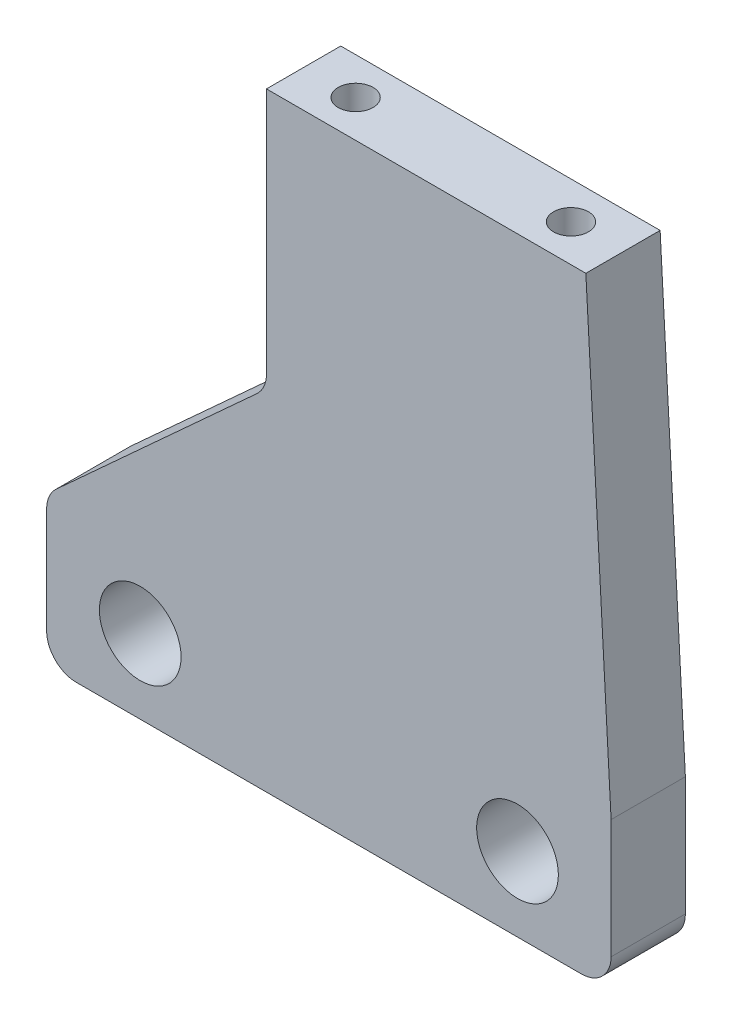
ISO-10303-21;
HEADER;
FILE_DESCRIPTION(('STEP AP214'),'2;1');
FILE_NAME('part.step','',(''),(''),'','','');
FILE_SCHEMA(('AUTOMOTIVE_DESIGN { 1 0 10303 214 1 1 1 1 }'));
ENDSEC;
DATA;
#1=APPLICATION_CONTEXT('core data for automotive mechanical design processes');
#2=APPLICATION_PROTOCOL_DEFINITION('international standard','automotive_design',2000,#1);
#3=PRODUCT_CONTEXT('',#1,'mechanical');
#4=PRODUCT('Part','Part','',(#3));
#5=PRODUCT_RELATED_PRODUCT_CATEGORY('part','',(#4));
#6=PRODUCT_DEFINITION_FORMATION('','',#4);
#7=PRODUCT_DEFINITION_CONTEXT('part definition',#1,'design');
#8=PRODUCT_DEFINITION('design','',#6,#7);
#9=PRODUCT_DEFINITION_SHAPE('','',#8);
#10=(LENGTH_UNIT() NAMED_UNIT(*) SI_UNIT(.MILLI.,.METRE.));
#11=(NAMED_UNIT(*) PLANE_ANGLE_UNIT() SI_UNIT($,.RADIAN.));
#12=(NAMED_UNIT(*) SI_UNIT($,.STERADIAN.) SOLID_ANGLE_UNIT());
#13=UNCERTAINTY_MEASURE_WITH_UNIT(LENGTH_MEASURE(1.E-05),#10,'distance_accuracy_value','');
#14=(GEOMETRIC_REPRESENTATION_CONTEXT(3) GLOBAL_UNCERTAINTY_ASSIGNED_CONTEXT((#13)) GLOBAL_UNIT_ASSIGNED_CONTEXT((#10,
#11,#12)) REPRESENTATION_CONTEXT('',''));
#15=CARTESIAN_POINT('',(0.,0.,0.));
#16=DIRECTION('',(0.,0.,1.));
#17=DIRECTION('',(1.,0.,0.));
#18=AXIS2_PLACEMENT_3D('',#15,#16,#17);
#19=CARTESIAN_POINT('',(19.,5.,5.));
#20=DIRECTION('',(-1.,0.,0.));
#21=DIRECTION('',(0.,0.,1.));
#22=AXIS2_PLACEMENT_3D('',#19,#20,#21);
#23=PLANE('',#22);
#24=DIRECTION('',(0.,1.,0.));
#25=VECTOR('',#24,1.);
#26=CARTESIAN_POINT('',(19.,5.,5.));
#27=LINE('',#26,#25);
#28=CARTESIAN_POINT('',(19.,-3.,5.));
#29=VERTEX_POINT('',#28);
#30=CARTESIAN_POINT('',(19.,5.,5.));
#31=VERTEX_POINT('',#30);
#32=EDGE_CURVE('E153',#29,#31,#27,.T.);
#33=ORIENTED_EDGE('',*,*,#32,.F.);
#34=DIRECTION('',(0.,0.,-1.));
#35=VECTOR('',#34,1.);
#36=CARTESIAN_POINT('',(19.,-3.,5.));
#37=LINE('',#36,#35);
#38=CARTESIAN_POINT('',(19.,-3.,0.));
#39=VERTEX_POINT('',#38);
#40=EDGE_CURVE('E230',#29,#39,#37,.T.);
#41=ORIENTED_EDGE('',*,*,#40,.T.);
#42=DIRECTION('',(0.,1.,0.));
#43=VECTOR('',#42,1.);
#44=CARTESIAN_POINT('',(19.,5.,0.));
#45=LINE('',#44,#43);
#46=CARTESIAN_POINT('',(19.,5.,0.));
#47=VERTEX_POINT('',#46);
#48=EDGE_CURVE('E198',#39,#47,#45,.T.);
#49=ORIENTED_EDGE('',*,*,#48,.T.);
#50=DIRECTION('',(0.,0.,-1.));
#51=VECTOR('',#50,1.);
#52=CARTESIAN_POINT('',(19.,5.,5.));
#53=LINE('',#52,#51);
#54=EDGE_CURVE('E219',#31,#47,#53,.T.);
#55=ORIENTED_EDGE('',*,*,#54,.F.);
#56=EDGE_LOOP('',(#33,#41,#49,#55));
#57=FACE_BOUND('',#56,.T.);
#58=ADVANCED_FACE('F39',(#57),#23,.F.);
#59=CARTESIAN_POINT('',(-19.,5.,5.));
#60=DIRECTION('',(1.,0.,0.));
#61=DIRECTION('',(0.,0.,-1.));
#62=AXIS2_PLACEMENT_3D('',#59,#60,#61);
#63=PLANE('',#62);
#64=DIRECTION('',(0.,-1.,0.));
#65=VECTOR('',#64,1.);
#66=CARTESIAN_POINT('',(-19.,5.,5.));
#67=LINE('',#66,#65);
#68=CARTESIAN_POINT('',(-19.,4.11726702158369,5.));
#69=VERTEX_POINT('',#68);
#70=CARTESIAN_POINT('',(-19.,-3.,5.));
#71=VERTEX_POINT('',#70);
#72=EDGE_CURVE('E212',#69,#71,#67,.T.);
#73=ORIENTED_EDGE('',*,*,#72,.F.);
#74=DIRECTION('',(0.,0.,-1.));
#75=VECTOR('',#74,1.);
#76=CARTESIAN_POINT('',(-19.,4.11726702158369,0.));
#77=LINE('',#76,#75);
#78=CARTESIAN_POINT('',(-19.,4.11726702158369,0.));
#79=VERTEX_POINT('',#78);
#80=EDGE_CURVE('E270',#69,#79,#77,.T.);
#81=ORIENTED_EDGE('',*,*,#80,.T.);
#82=DIRECTION('',(0.,-1.,0.));
#83=VECTOR('',#82,1.);
#84=CARTESIAN_POINT('',(-19.,5.,0.));
#85=LINE('',#84,#83);
#86=CARTESIAN_POINT('',(-19.,-3.,0.));
#87=VERTEX_POINT('',#86);
#88=EDGE_CURVE('E222',#79,#87,#85,.T.);
#89=ORIENTED_EDGE('',*,*,#88,.T.);
#90=DIRECTION('',(0.,0.,-1.));
#91=VECTOR('',#90,1.);
#92=CARTESIAN_POINT('',(-19.,-3.,5.));
#93=LINE('',#92,#91);
#94=EDGE_CURVE('E62',#87,#71,#93,.F.);
#95=ORIENTED_EDGE('',*,*,#94,.T.);
#96=EDGE_LOOP('',(#73,#81,#89,#95));
#97=FACE_BOUND('',#96,.T.);
#98=ADVANCED_FACE('F303',(#97),#63,.F.);
#99=CARTESIAN_POINT('',(-19.,-5.,5.));
#100=DIRECTION('',(0.,1.,0.));
#101=DIRECTION('',(0.,0.,1.));
#102=AXIS2_PLACEMENT_3D('',#99,#100,#101);
#103=PLANE('',#102);
#104=DIRECTION('',(1.,0.,0.));
#105=VECTOR('',#104,1.);
#106=CARTESIAN_POINT('',(-19.,-5.,0.));
#107=LINE('',#106,#105);
#108=CARTESIAN_POINT('',(-17.,-5.,0.));
#109=VERTEX_POINT('',#108);
#110=CARTESIAN_POINT('',(17.,-5.,0.));
#111=VERTEX_POINT('',#110);
#112=EDGE_CURVE('E213',#109,#111,#107,.T.);
#113=ORIENTED_EDGE('',*,*,#112,.T.);
#114=DIRECTION('',(0.,0.,-1.));
#115=VECTOR('',#114,1.);
#116=CARTESIAN_POINT('',(17.,-5.,5.));
#117=LINE('',#116,#115);
#118=CARTESIAN_POINT('',(17.,-5.,5.));
#119=VERTEX_POINT('',#118);
#120=EDGE_CURVE('E247',#111,#119,#117,.F.);
#121=ORIENTED_EDGE('',*,*,#120,.T.);
#122=DIRECTION('',(1.,0.,0.));
#123=VECTOR('',#122,1.);
#124=CARTESIAN_POINT('',(-19.,-5.,5.));
#125=LINE('',#124,#123);
#126=CARTESIAN_POINT('',(-17.,-5.,5.));
#127=VERTEX_POINT('',#126);
#128=EDGE_CURVE('E216',#127,#119,#125,.T.);
#129=ORIENTED_EDGE('',*,*,#128,.F.);
#130=DIRECTION('',(0.,0.,-1.));
#131=VECTOR('',#130,1.);
#132=CARTESIAN_POINT('',(-17.,-5.,5.));
#133=LINE('',#132,#131);
#134=EDGE_CURVE('E243',#127,#109,#133,.T.);
#135=ORIENTED_EDGE('',*,*,#134,.T.);
#136=EDGE_LOOP('',(#113,#121,#129,#135));
#137=FACE_BOUND('',#136,.T.);
#138=ADVANCED_FACE('F309',(#137),#103,.F.);
#139=CARTESIAN_POINT('',(0.,0.,5.));
#140=DIRECTION('',(0.,0.,1.));
#141=DIRECTION('',(1.,0.,0.));
#142=AXIS2_PLACEMENT_3D('',#139,#140,#141);
#143=PLANE('',#142);
#144=ORIENTED_EDGE('',*,*,#128,.T.);
#145=CARTESIAN_POINT('',(17.,-3.,5.));
#146=DIRECTION('',(0.,0.,1.));
#147=DIRECTION('',(1.,0.,0.));
#148=AXIS2_PLACEMENT_3D('',#145,#146,#147);
#149=CIRCLE('',#148,2.);
#150=EDGE_CURVE('E256',#119,#29,#149,.T.);
#151=ORIENTED_EDGE('',*,*,#150,.T.);
#152=ORIENTED_EDGE('',*,*,#32,.T.);
#153=DIRECTION('',(-0.0547564374037948,0.998499740892728,0.));
#154=VECTOR('',#153,1.);
#155=CARTESIAN_POINT('',(19.,5.,5.));
#156=LINE('',#155,#154);
#157=CARTESIAN_POINT('',(17.3,36.,5.));
#158=VERTEX_POINT('',#157);
#159=EDGE_CURVE('E143',#31,#158,#156,.T.);
#160=ORIENTED_EDGE('',*,*,#159,.T.);
#161=DIRECTION('',(-1.,0.,0.));
#162=VECTOR('',#161,1.);
#163=CARTESIAN_POINT('',(17.3,36.,5.));
#164=LINE('',#163,#162);
#165=CARTESIAN_POINT('',(-4.19999999999999,36.,5.));
#166=VERTEX_POINT('',#165);
#167=EDGE_CURVE('E123',#158,#166,#164,.T.);
#168=ORIENTED_EDGE('',*,*,#167,.T.);
#169=DIRECTION('',(0.,-1.,0.));
#170=VECTOR('',#169,1.);
#171=CARTESIAN_POINT('',(-4.19999999999999,5.,5.));
#172=LINE('',#171,#170);
#173=CARTESIAN_POINT('',(-4.19999999999999,19.3827329784163,5.));
#174=VERTEX_POINT('',#173);
#175=EDGE_CURVE('E135',#166,#174,#172,.T.);
#176=ORIENTED_EDGE('',*,*,#175,.T.);
#177=CARTESIAN_POINT('',(-6.19999999999999,19.3827329784163,5.));
#178=DIRECTION('',(0.,0.,1.));
#179=DIRECTION('',(1.,0.,0.));
#180=AXIS2_PLACEMENT_3D('',#177,#178,#179);
#181=CIRCLE('',#180,2.);
#182=CARTESIAN_POINT('',(-4.85217162379431,17.905113721539,5.));
#183=VERTEX_POINT('',#182);
#184=EDGE_CURVE('E48',#174,#183,#181,.F.);
#185=ORIENTED_EDGE('',*,*,#184,.T.);
#186=DIRECTION('',(-0.738809628438671,-0.673914188102842,0.));
#187=VECTOR('',#186,1.);
#188=CARTESIAN_POINT('',(-19.,5.,5.));
#189=LINE('',#188,#187);
#190=CARTESIAN_POINT('',(-18.3478283762057,5.59488627846103,5.));
#191=VERTEX_POINT('',#190);
#192=EDGE_CURVE('E165',#183,#191,#189,.T.);
#193=ORIENTED_EDGE('',*,*,#192,.T.);
#194=CARTESIAN_POINT('',(-17.,4.11726702158369,5.));
#195=DIRECTION('',(0.,0.,1.));
#196=DIRECTION('',(1.,0.,0.));
#197=AXIS2_PLACEMENT_3D('',#194,#195,#196);
#198=CIRCLE('',#197,2.);
#199=EDGE_CURVE('E253',#191,#69,#198,.T.);
#200=ORIENTED_EDGE('',*,*,#199,.T.);
#201=ORIENTED_EDGE('',*,*,#72,.T.);
#202=CARTESIAN_POINT('',(-17.,-3.,5.));
#203=DIRECTION('',(0.,0.,1.));
#204=DIRECTION('',(1.,0.,0.));
#205=AXIS2_PLACEMENT_3D('',#202,#203,#204);
#206=CIRCLE('',#205,2.);
#207=EDGE_CURVE('E250',#71,#127,#206,.T.);
#208=ORIENTED_EDGE('',*,*,#207,.T.);
#209=EDGE_LOOP('',(#144,#151,#152,#160,#168,#176,#185,#193,#200,#201,#208));
#210=FACE_BOUND('',#209,.T.);
#211=CARTESIAN_POINT('',(-12.7,0.,5.));
#212=DIRECTION('',(0.,0.,1.));
#213=DIRECTION('',(1.,0.,0.));
#214=AXIS2_PLACEMENT_3D('',#211,#212,#213);
#215=CIRCLE('',#214,2.75);
#216=CARTESIAN_POINT('',(-9.95,0.,5.));
#217=VERTEX_POINT('',#216);
#218=EDGE_CURVE('E199',#217,#217,#215,.T.);
#219=ORIENTED_EDGE('',*,*,#218,.F.);
#220=EDGE_LOOP('',(#219));
#221=FACE_BOUND('',#220,.T.);
#222=CARTESIAN_POINT('',(12.7,0.,5.));
#223=DIRECTION('',(0.,0.,1.));
#224=DIRECTION('',(1.,0.,0.));
#225=AXIS2_PLACEMENT_3D('',#222,#223,#224);
#226=CIRCLE('',#225,2.75);
#227=CARTESIAN_POINT('',(15.45,0.,5.));
#228=VERTEX_POINT('',#227);
#229=EDGE_CURVE('E192',#228,#228,#226,.T.);
#230=ORIENTED_EDGE('',*,*,#229,.F.);
#231=EDGE_LOOP('',(#230));
#232=FACE_BOUND('',#231,.T.);
#233=ADVANCED_FACE('F150',(#210,#221,#232),#143,.T.);
#234=CARTESIAN_POINT('',(0.,0.,0.));
#235=DIRECTION('',(0.,0.,1.));
#236=DIRECTION('',(1.,0.,0.));
#237=AXIS2_PLACEMENT_3D('',#234,#235,#236);
#238=PLANE('',#237);
#239=ORIENTED_EDGE('',*,*,#48,.F.);
#240=CARTESIAN_POINT('',(17.,-3.,0.));
#241=DIRECTION('',(0.,0.,1.));
#242=DIRECTION('',(1.,0.,0.));
#243=AXIS2_PLACEMENT_3D('',#240,#241,#242);
#244=CIRCLE('',#243,2.);
#245=EDGE_CURVE('E240',#39,#111,#244,.F.);
#246=ORIENTED_EDGE('',*,*,#245,.T.);
#247=ORIENTED_EDGE('',*,*,#112,.F.);
#248=CARTESIAN_POINT('',(-17.,-3.,0.));
#249=DIRECTION('',(0.,0.,1.));
#250=DIRECTION('',(1.,0.,0.));
#251=AXIS2_PLACEMENT_3D('',#248,#249,#250);
#252=CIRCLE('',#251,2.);
#253=EDGE_CURVE('E234',#109,#87,#252,.F.);
#254=ORIENTED_EDGE('',*,*,#253,.T.);
#255=ORIENTED_EDGE('',*,*,#88,.F.);
#256=CARTESIAN_POINT('',(-17.,4.11726702158369,0.));
#257=DIRECTION('',(0.,0.,1.));
#258=DIRECTION('',(1.,0.,0.));
#259=AXIS2_PLACEMENT_3D('',#256,#257,#258);
#260=CIRCLE('',#259,2.);
#261=CARTESIAN_POINT('',(-18.3478283762057,5.59488627846103,0.));
#262=VERTEX_POINT('',#261);
#263=EDGE_CURVE('E237',#79,#262,#260,.F.);
#264=ORIENTED_EDGE('',*,*,#263,.T.);
#265=DIRECTION('',(-0.738809628438671,-0.673914188102842,0.));
#266=VECTOR('',#265,1.);
#267=CARTESIAN_POINT('',(-19.,5.,0.));
#268=LINE('',#267,#266);
#269=CARTESIAN_POINT('',(-4.85217162379431,17.905113721539,0.));
#270=VERTEX_POINT('',#269);
#271=EDGE_CURVE('E136',#270,#262,#268,.T.);
#272=ORIENTED_EDGE('',*,*,#271,.F.);
#273=CARTESIAN_POINT('',(-6.19999999999999,19.3827329784163,0.));
#274=DIRECTION('',(0.,0.,1.));
#275=DIRECTION('',(1.,0.,0.));
#276=AXIS2_PLACEMENT_3D('',#273,#274,#275);
#277=CIRCLE('',#276,2.);
#278=CARTESIAN_POINT('',(-4.19999999999999,19.3827329784163,0.));
#279=VERTEX_POINT('',#278);
#280=EDGE_CURVE('E11',#270,#279,#277,.T.);
#281=ORIENTED_EDGE('',*,*,#280,.T.);
#282=DIRECTION('',(0.,-1.,0.));
#283=VECTOR('',#282,1.);
#284=CARTESIAN_POINT('',(-4.19999999999999,5.,0.));
#285=LINE('',#284,#283);
#286=CARTESIAN_POINT('',(-4.19999999999999,36.,0.));
#287=VERTEX_POINT('',#286);
#288=EDGE_CURVE('E147',#287,#279,#285,.T.);
#289=ORIENTED_EDGE('',*,*,#288,.F.);
#290=DIRECTION('',(-1.,0.,0.));
#291=VECTOR('',#290,1.);
#292=CARTESIAN_POINT('',(17.3,36.,0.));
#293=LINE('',#292,#291);
#294=CARTESIAN_POINT('',(17.3,36.,0.));
#295=VERTEX_POINT('',#294);
#296=EDGE_CURVE('E183',#295,#287,#293,.T.);
#297=ORIENTED_EDGE('',*,*,#296,.F.);
#298=DIRECTION('',(-0.0547564374037948,0.998499740892728,0.));
#299=VECTOR('',#298,1.);
#300=CARTESIAN_POINT('',(19.,5.,0.));
#301=LINE('',#300,#299);
#302=EDGE_CURVE('E145',#47,#295,#301,.T.);
#303=ORIENTED_EDGE('',*,*,#302,.F.);
#304=EDGE_LOOP('',(#239,#246,#247,#254,#255,#264,#272,#281,#289,#297,#303));
#305=FACE_BOUND('',#304,.T.);
#306=CARTESIAN_POINT('',(-12.7,0.,0.));
#307=DIRECTION('',(0.,0.,1.));
#308=DIRECTION('',(1.,0.,0.));
#309=AXIS2_PLACEMENT_3D('',#306,#307,#308);
#310=CIRCLE('',#309,2.75);
#311=CARTESIAN_POINT('',(-9.95,0.,0.));
#312=VERTEX_POINT('',#311);
#313=EDGE_CURVE('E194',#312,#312,#310,.T.);
#314=ORIENTED_EDGE('',*,*,#313,.T.);
#315=EDGE_LOOP('',(#314));
#316=FACE_BOUND('',#315,.T.);
#317=CARTESIAN_POINT('',(12.7,0.,0.));
#318=DIRECTION('',(0.,0.,1.));
#319=DIRECTION('',(1.,0.,0.));
#320=AXIS2_PLACEMENT_3D('',#317,#318,#319);
#321=CIRCLE('',#320,2.75);
#322=CARTESIAN_POINT('',(15.45,0.,0.));
#323=VERTEX_POINT('',#322);
#324=EDGE_CURVE('E203',#323,#323,#321,.T.);
#325=ORIENTED_EDGE('',*,*,#324,.T.);
#326=EDGE_LOOP('',(#325));
#327=FACE_BOUND('',#326,.T.);
#328=ADVANCED_FACE('F285',(#305,#316,#327),#238,.F.);
#329=CARTESIAN_POINT('',(12.7,0.,0.));
#330=DIRECTION('',(0.,0.,1.));
#331=DIRECTION('',(1.,0.,0.));
#332=AXIS2_PLACEMENT_3D('',#329,#330,#331);
#333=CYLINDRICAL_SURFACE('',#332,2.75);
#334=ORIENTED_EDGE('',*,*,#324,.F.);
#335=EDGE_LOOP('',(#334));
#336=FACE_BOUND('',#335,.T.);
#337=ORIENTED_EDGE('',*,*,#229,.T.);
#338=EDGE_LOOP('',(#337));
#339=FACE_BOUND('',#338,.T.);
#340=ADVANCED_FACE('F298',(#336,#339),#333,.F.);
#341=CARTESIAN_POINT('',(-12.7,0.,0.));
#342=DIRECTION('',(0.,0.,1.));
#343=DIRECTION('',(1.,0.,0.));
#344=AXIS2_PLACEMENT_3D('',#341,#342,#343);
#345=CYLINDRICAL_SURFACE('',#344,2.75);
#346=ORIENTED_EDGE('',*,*,#313,.F.);
#347=EDGE_LOOP('',(#346));
#348=FACE_BOUND('',#347,.T.);
#349=ORIENTED_EDGE('',*,*,#218,.T.);
#350=EDGE_LOOP('',(#349));
#351=FACE_BOUND('',#350,.T.);
#352=ADVANCED_FACE('F290',(#348,#351),#345,.F.);
#353=CARTESIAN_POINT('',(-4.19999999999999,5.,0.));
#354=DIRECTION('',(-1.,0.,0.));
#355=DIRECTION('',(0.,0.,1.));
#356=AXIS2_PLACEMENT_3D('',#353,#354,#355);
#357=PLANE('',#356);
#358=ORIENTED_EDGE('',*,*,#288,.T.);
#359=DIRECTION('',(0.,0.,1.));
#360=VECTOR('',#359,1.);
#361=CARTESIAN_POINT('',(-4.19999999999999,19.3827329784163,5.));
#362=LINE('',#361,#360);
#363=EDGE_CURVE('E259',#279,#174,#362,.T.);
#364=ORIENTED_EDGE('',*,*,#363,.T.);
#365=ORIENTED_EDGE('',*,*,#175,.F.);
#366=DIRECTION('',(0.,0.,1.));
#367=VECTOR('',#366,1.);
#368=CARTESIAN_POINT('',(-4.19999999999999,36.,0.));
#369=LINE('',#368,#367);
#370=EDGE_CURVE('E129',#287,#166,#369,.T.);
#371=ORIENTED_EDGE('',*,*,#370,.F.);
#372=EDGE_LOOP('',(#358,#364,#365,#371));
#373=FACE_BOUND('',#372,.T.);
#374=ADVANCED_FACE('F288',(#373),#357,.T.);
#375=CARTESIAN_POINT('',(17.3,36.,0.));
#376=DIRECTION('',(0.,1.,0.));
#377=DIRECTION('',(-1.,0.,0.));
#378=AXIS2_PLACEMENT_3D('',#375,#376,#377);
#379=PLANE('',#378);
#380=CARTESIAN_POINT('',(-0.699999999999993,36.,2.5));
#381=DIRECTION('',(0.,1.,0.));
#382=DIRECTION('',(0.,0.,1.));
#383=AXIS2_PLACEMENT_3D('',#380,#381,#382);
#384=CIRCLE('',#383,1.175);
#385=CARTESIAN_POINT('',(-0.699999999999993,36.,3.675));
#386=VERTEX_POINT('',#385);
#387=EDGE_CURVE('E166',#386,#386,#384,.T.);
#388=ORIENTED_EDGE('',*,*,#387,.F.);
#389=EDGE_LOOP('',(#388));
#390=FACE_BOUND('',#389,.T.);
#391=CARTESIAN_POINT('',(13.8,36.,2.5));
#392=DIRECTION('',(0.,1.,0.));
#393=DIRECTION('',(0.,0.,1.));
#394=AXIS2_PLACEMENT_3D('',#391,#392,#393);
#395=CIRCLE('',#394,1.175);
#396=CARTESIAN_POINT('',(13.8,36.,3.675));
#397=VERTEX_POINT('',#396);
#398=EDGE_CURVE('E158',#397,#397,#395,.T.);
#399=ORIENTED_EDGE('',*,*,#398,.F.);
#400=EDGE_LOOP('',(#399));
#401=FACE_BOUND('',#400,.T.);
#402=ORIENTED_EDGE('',*,*,#167,.F.);
#403=DIRECTION('',(0.,0.,1.));
#404=VECTOR('',#403,1.);
#405=CARTESIAN_POINT('',(17.3,36.,0.));
#406=LINE('',#405,#404);
#407=EDGE_CURVE('E127',#295,#158,#406,.T.);
#408=ORIENTED_EDGE('',*,*,#407,.F.);
#409=ORIENTED_EDGE('',*,*,#296,.T.);
#410=ORIENTED_EDGE('',*,*,#370,.T.);
#411=EDGE_LOOP('',(#402,#408,#409,#410));
#412=FACE_BOUND('',#411,.T.);
#413=ADVANCED_FACE('F125',(#390,#401,#412),#379,.T.);
#414=CARTESIAN_POINT('',(-19.,5.,0.));
#415=DIRECTION('',(-0.673914188102842,0.738809628438671,0.));
#416=DIRECTION('',(-0.738809628438671,-0.673914188102842,0.));
#417=AXIS2_PLACEMENT_3D('',#414,#415,#416);
#418=PLANE('',#417);
#419=ORIENTED_EDGE('',*,*,#192,.F.);
#420=DIRECTION('',(0.,0.,1.));
#421=VECTOR('',#420,1.);
#422=CARTESIAN_POINT('',(-4.85217162379431,17.905113721539,0.));
#423=LINE('',#422,#421);
#424=EDGE_CURVE('E265',#183,#270,#423,.F.);
#425=ORIENTED_EDGE('',*,*,#424,.T.);
#426=ORIENTED_EDGE('',*,*,#271,.T.);
#427=DIRECTION('',(0.,0.,-1.));
#428=VECTOR('',#427,1.);
#429=CARTESIAN_POINT('',(-18.3478283762057,5.59488627846103,5.));
#430=LINE('',#429,#428);
#431=EDGE_CURVE('E262',#262,#191,#430,.F.);
#432=ORIENTED_EDGE('',*,*,#431,.T.);
#433=EDGE_LOOP('',(#419,#425,#426,#432));
#434=FACE_BOUND('',#433,.T.);
#435=ADVANCED_FACE('F277',(#434),#418,.T.);
#436=CARTESIAN_POINT('',(13.8,28.,2.5));
#437=DIRECTION('',(0.,1.,0.));
#438=DIRECTION('',(0.,0.,1.));
#439=AXIS2_PLACEMENT_3D('',#436,#437,#438);
#440=CYLINDRICAL_SURFACE('',#439,1.175);
#441=CARTESIAN_POINT('',(13.8,28.,2.5));
#442=DIRECTION('',(0.,1.,0.));
#443=DIRECTION('',(0.,0.,1.));
#444=AXIS2_PLACEMENT_3D('',#441,#442,#443);
#445=CIRCLE('',#444,1.175);
#446=CARTESIAN_POINT('',(13.8,28.,3.675));
#447=VERTEX_POINT('',#446);
#448=EDGE_CURVE('E170',#447,#447,#445,.T.);
#449=ORIENTED_EDGE('',*,*,#448,.F.);
#450=EDGE_LOOP('',(#449));
#451=FACE_BOUND('',#450,.T.);
#452=ORIENTED_EDGE('',*,*,#398,.T.);
#453=EDGE_LOOP('',(#452));
#454=FACE_BOUND('',#453,.T.);
#455=ADVANCED_FACE('F365',(#451,#454),#440,.F.);
#456=CARTESIAN_POINT('',(13.8,28.,2.5));
#457=DIRECTION('',(0.,1.,0.));
#458=DIRECTION('',(0.,0.,1.));
#459=AXIS2_PLACEMENT_3D('',#456,#457,#458);
#460=PLANE('',#459);
#461=ORIENTED_EDGE('',*,*,#448,.T.);
#462=EDGE_LOOP('',(#461));
#463=FACE_BOUND('',#462,.T.);
#464=ADVANCED_FACE('F370',(#463),#460,.T.);
#465=CARTESIAN_POINT('',(-0.699999999999993,28.,2.5));
#466=DIRECTION('',(0.,1.,0.));
#467=DIRECTION('',(0.,0.,1.));
#468=AXIS2_PLACEMENT_3D('',#465,#466,#467);
#469=CYLINDRICAL_SURFACE('',#468,1.175);
#470=CARTESIAN_POINT('',(-0.699999999999993,28.,2.5));
#471=DIRECTION('',(0.,1.,0.));
#472=DIRECTION('',(0.,0.,1.));
#473=AXIS2_PLACEMENT_3D('',#470,#471,#472);
#474=CIRCLE('',#473,1.175);
#475=CARTESIAN_POINT('',(-0.699999999999993,28.,3.675));
#476=VERTEX_POINT('',#475);
#477=EDGE_CURVE('E161',#476,#476,#474,.T.);
#478=ORIENTED_EDGE('',*,*,#477,.F.);
#479=EDGE_LOOP('',(#478));
#480=FACE_BOUND('',#479,.T.);
#481=ORIENTED_EDGE('',*,*,#387,.T.);
#482=EDGE_LOOP('',(#481));
#483=FACE_BOUND('',#482,.T.);
#484=ADVANCED_FACE('F382',(#480,#483),#469,.F.);
#485=CARTESIAN_POINT('',(-0.699999999999993,28.,2.5));
#486=DIRECTION('',(0.,1.,0.));
#487=DIRECTION('',(0.,0.,1.));
#488=AXIS2_PLACEMENT_3D('',#485,#486,#487);
#489=PLANE('',#488);
#490=ORIENTED_EDGE('',*,*,#477,.T.);
#491=EDGE_LOOP('',(#490));
#492=FACE_BOUND('',#491,.T.);
#493=ADVANCED_FACE('F316',(#492),#489,.T.);
#494=CARTESIAN_POINT('',(17.,-3.,5.));
#495=DIRECTION('',(0.,0.,-1.));
#496=DIRECTION('',(-1.,0.,0.));
#497=AXIS2_PLACEMENT_3D('',#494,#495,#496);
#498=CYLINDRICAL_SURFACE('',#497,2.);
#499=ORIENTED_EDGE('',*,*,#150,.F.);
#500=ORIENTED_EDGE('',*,*,#120,.F.);
#501=ORIENTED_EDGE('',*,*,#245,.F.);
#502=ORIENTED_EDGE('',*,*,#40,.F.);
#503=EDGE_LOOP('',(#499,#500,#501,#502));
#504=FACE_BOUND('',#503,.T.);
#505=ADVANCED_FACE('F313',(#504),#498,.T.);
#506=CARTESIAN_POINT('',(-6.19999999999999,19.3827329784163,0.));
#507=DIRECTION('',(0.,0.,-1.));
#508=DIRECTION('',(-1.,0.,0.));
#509=AXIS2_PLACEMENT_3D('',#506,#507,#508);
#510=CYLINDRICAL_SURFACE('',#509,2.);
#511=ORIENTED_EDGE('',*,*,#280,.F.);
#512=ORIENTED_EDGE('',*,*,#424,.F.);
#513=ORIENTED_EDGE('',*,*,#184,.F.);
#514=ORIENTED_EDGE('',*,*,#363,.F.);
#515=EDGE_LOOP('',(#511,#512,#513,#514));
#516=FACE_BOUND('',#515,.T.);
#517=ADVANCED_FACE('F281',(#516),#510,.F.);
#518=CARTESIAN_POINT('',(-17.,4.11726702158369,5.));
#519=DIRECTION('',(0.,0.,1.));
#520=DIRECTION('',(1.,0.,0.));
#521=AXIS2_PLACEMENT_3D('',#518,#519,#520);
#522=CYLINDRICAL_SURFACE('',#521,2.);
#523=ORIENTED_EDGE('',*,*,#199,.F.);
#524=ORIENTED_EDGE('',*,*,#431,.F.);
#525=ORIENTED_EDGE('',*,*,#263,.F.);
#526=ORIENTED_EDGE('',*,*,#80,.F.);
#527=EDGE_LOOP('',(#523,#524,#525,#526));
#528=FACE_BOUND('',#527,.T.);
#529=ADVANCED_FACE('F319',(#528),#522,.T.);
#530=CARTESIAN_POINT('',(-17.,-3.,5.));
#531=DIRECTION('',(0.,0.,-1.));
#532=DIRECTION('',(-1.,0.,0.));
#533=AXIS2_PLACEMENT_3D('',#530,#531,#532);
#534=CYLINDRICAL_SURFACE('',#533,2.);
#535=ORIENTED_EDGE('',*,*,#207,.F.);
#536=ORIENTED_EDGE('',*,*,#94,.F.);
#537=ORIENTED_EDGE('',*,*,#253,.F.);
#538=ORIENTED_EDGE('',*,*,#134,.F.);
#539=EDGE_LOOP('',(#535,#536,#537,#538));
#540=FACE_BOUND('',#539,.T.);
#541=ADVANCED_FACE('F41',(#540),#534,.T.);
#542=CARTESIAN_POINT('',(19.,5.,0.));
#543=DIRECTION('',(0.998499740892728,0.0547564374037948,0.));
#544=DIRECTION('',(-0.0547564374037948,0.998499740892728,0.));
#545=AXIS2_PLACEMENT_3D('',#542,#543,#544);
#546=PLANE('',#545);
#547=ORIENTED_EDGE('',*,*,#159,.F.);
#548=ORIENTED_EDGE('',*,*,#54,.T.);
#549=ORIENTED_EDGE('',*,*,#302,.T.);
#550=ORIENTED_EDGE('',*,*,#407,.T.);
#551=EDGE_LOOP('',(#547,#548,#549,#550));
#552=FACE_BOUND('',#551,.T.);
#553=ADVANCED_FACE('F141',(#552),#546,.T.);
#554=CLOSED_SHELL('',(#58,#98,#138,#233,#328,#340,#352,#374,#413,#435,#455,#464,#484,#493,#505,
#517,#529,#541,#553));
#555=MANIFOLD_SOLID_BREP('B2',#554);
#556=ADVANCED_BREP_SHAPE_REPRESENTATION('',(#18,#555),#14);
#557=SHAPE_DEFINITION_REPRESENTATION(#9,#556);
ENDSEC;
END-ISO-10303-21;
